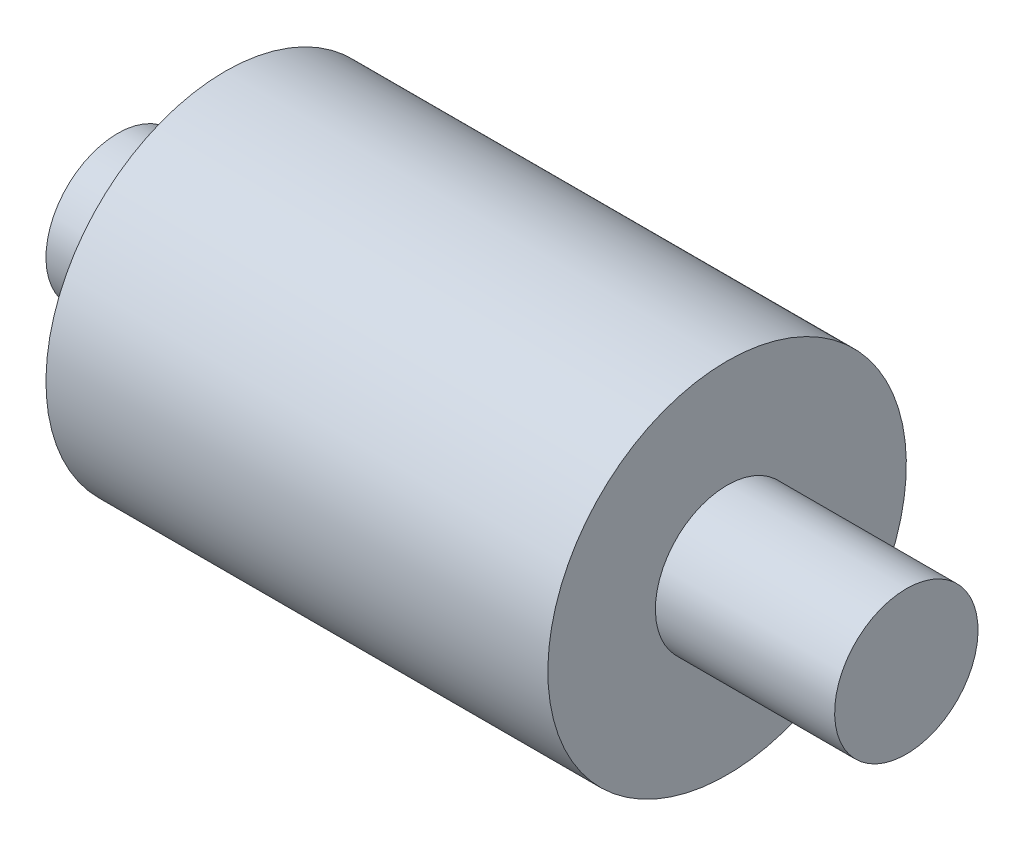
ISO-10303-21;
HEADER;
FILE_DESCRIPTION(('STEP AP214'),'2;1');
FILE_NAME('part.step','',(''),(''),'','','');
FILE_SCHEMA(('AUTOMOTIVE_DESIGN { 1 0 10303 214 1 1 1 1 }'));
ENDSEC;
DATA;
#1=APPLICATION_CONTEXT('core data for automotive mechanical design processes');
#2=APPLICATION_PROTOCOL_DEFINITION('international standard','automotive_design',2000,#1);
#3=PRODUCT_CONTEXT('',#1,'mechanical');
#4=PRODUCT('Part','Part','',(#3));
#5=PRODUCT_RELATED_PRODUCT_CATEGORY('part','',(#4));
#6=PRODUCT_DEFINITION_FORMATION('','',#4);
#7=PRODUCT_DEFINITION_CONTEXT('part definition',#1,'design');
#8=PRODUCT_DEFINITION('design','',#6,#7);
#9=PRODUCT_DEFINITION_SHAPE('','',#8);
#10=(LENGTH_UNIT() NAMED_UNIT(*) SI_UNIT(.MILLI.,.METRE.));
#11=(NAMED_UNIT(*) PLANE_ANGLE_UNIT() SI_UNIT($,.RADIAN.));
#12=(NAMED_UNIT(*) SI_UNIT($,.STERADIAN.) SOLID_ANGLE_UNIT());
#13=UNCERTAINTY_MEASURE_WITH_UNIT(LENGTH_MEASURE(1.E-05),#10,'distance_accuracy_value','');
#14=(GEOMETRIC_REPRESENTATION_CONTEXT(3) GLOBAL_UNCERTAINTY_ASSIGNED_CONTEXT((#13)) GLOBAL_UNIT_ASSIGNED_CONTEXT((#10,
#11,#12)) REPRESENTATION_CONTEXT('',''));
#15=CARTESIAN_POINT('',(0.,0.,0.));
#16=DIRECTION('',(0.,0.,1.));
#17=DIRECTION('',(1.,0.,0.));
#18=AXIS2_PLACEMENT_3D('',#15,#16,#17);
#19=CARTESIAN_POINT('',(-38.291065143824,-2.,0.));
#20=DIRECTION('',(-1.,0.,0.));
#21=DIRECTION('',(0.,-1.,0.));
#22=AXIS2_PLACEMENT_3D('',#19,#20,#21);
#23=PLANE('',#22);
#24=CARTESIAN_POINT('',(-38.291065143824,-2.,0.));
#25=DIRECTION('',(1.,0.,0.));
#26=DIRECTION('',(0.,1.,0.));
#27=AXIS2_PLACEMENT_3D('',#24,#25,#26);
#28=CIRCLE('',#27,2.);
#29=CARTESIAN_POINT('',(-38.291065143824,0.,0.));
#30=VERTEX_POINT('',#29);
#31=EDGE_CURVE('E10',#30,#30,#28,.T.);
#32=ORIENTED_EDGE('',*,*,#31,.F.);
#33=EDGE_LOOP('',(#32));
#34=FACE_BOUND('',#33,.T.);
#35=ADVANCED_FACE('F30',(#34),#23,.T.);
#36=CARTESIAN_POINT('',(-16.291065143824,-2.,0.));
#37=DIRECTION('',(1.,0.,0.));
#38=DIRECTION('',(0.,1.,0.));
#39=AXIS2_PLACEMENT_3D('',#36,#37,#38);
#40=CYLINDRICAL_SURFACE('',#39,2.);
#41=ORIENTED_EDGE('',*,*,#31,.T.);
#42=EDGE_LOOP('',(#41));
#43=FACE_BOUND('',#42,.T.);
#44=CARTESIAN_POINT('',(-35.291065143824,-2.,0.));
#45=DIRECTION('',(1.,0.,0.));
#46=DIRECTION('',(0.,1.,0.));
#47=AXIS2_PLACEMENT_3D('',#44,#45,#46);
#48=CIRCLE('',#47,2.);
#49=CARTESIAN_POINT('',(-35.291065143824,0.,0.));
#50=VERTEX_POINT('',#49);
#51=EDGE_CURVE('E36',#50,#50,#48,.T.);
#52=ORIENTED_EDGE('',*,*,#51,.F.);
#53=EDGE_LOOP('',(#52));
#54=FACE_BOUND('',#53,.T.);
#55=ADVANCED_FACE('F72',(#43,#54),#40,.T.);
#56=CARTESIAN_POINT('',(-35.291065143824,0.,0.));
#57=DIRECTION('',(-1.,0.,0.));
#58=DIRECTION('',(0.,-1.,0.));
#59=AXIS2_PLACEMENT_3D('',#56,#57,#58);
#60=PLANE('',#59);
#61=ORIENTED_EDGE('',*,*,#51,.T.);
#62=EDGE_LOOP('',(#61));
#63=FACE_BOUND('',#62,.T.);
#64=CARTESIAN_POINT('',(-35.291065143824,-2.,0.));
#65=DIRECTION('',(1.,0.,0.));
#66=DIRECTION('',(0.,1.,0.));
#67=AXIS2_PLACEMENT_3D('',#64,#65,#66);
#68=CIRCLE('',#67,5.);
#69=CARTESIAN_POINT('',(-35.291065143824,3.,0.));
#70=VERTEX_POINT('',#69);
#71=EDGE_CURVE('E40',#70,#70,#68,.T.);
#72=ORIENTED_EDGE('',*,*,#71,.F.);
#73=EDGE_LOOP('',(#72));
#74=FACE_BOUND('',#73,.T.);
#75=ADVANCED_FACE('F77',(#63,#74),#60,.T.);
#76=CARTESIAN_POINT('',(-16.291065143824,-2.,0.));
#77=DIRECTION('',(1.,0.,0.));
#78=DIRECTION('',(0.,1.,0.));
#79=AXIS2_PLACEMENT_3D('',#76,#77,#78);
#80=CYLINDRICAL_SURFACE('',#79,5.);
#81=ORIENTED_EDGE('',*,*,#71,.T.);
#82=EDGE_LOOP('',(#81));
#83=FACE_BOUND('',#82,.T.);
#84=CARTESIAN_POINT('',(-21.291065143824,-2.,0.));
#85=DIRECTION('',(1.,0.,0.));
#86=DIRECTION('',(0.,1.,0.));
#87=AXIS2_PLACEMENT_3D('',#84,#85,#86);
#88=CIRCLE('',#87,5.);
#89=CARTESIAN_POINT('',(-21.291065143824,3.,0.));
#90=VERTEX_POINT('',#89);
#91=EDGE_CURVE('E44',#90,#90,#88,.T.);
#92=ORIENTED_EDGE('',*,*,#91,.F.);
#93=EDGE_LOOP('',(#92));
#94=FACE_BOUND('',#93,.T.);
#95=ADVANCED_FACE('F68',(#83,#94),#80,.T.);
#96=CARTESIAN_POINT('',(-21.291065143824,3.,0.));
#97=DIRECTION('',(1.,0.,0.));
#98=DIRECTION('',(0.,1.,0.));
#99=AXIS2_PLACEMENT_3D('',#96,#97,#98);
#100=PLANE('',#99);
#101=ORIENTED_EDGE('',*,*,#91,.T.);
#102=EDGE_LOOP('',(#101));
#103=FACE_BOUND('',#102,.T.);
#104=CARTESIAN_POINT('',(-21.291065143824,-2.,0.));
#105=DIRECTION('',(1.,0.,0.));
#106=DIRECTION('',(0.,1.,0.));
#107=AXIS2_PLACEMENT_3D('',#104,#105,#106);
#108=CIRCLE('',#107,2.);
#109=CARTESIAN_POINT('',(-21.291065143824,0.,0.));
#110=VERTEX_POINT('',#109);
#111=EDGE_CURVE('E49',#110,#110,#108,.T.);
#112=ORIENTED_EDGE('',*,*,#111,.F.);
#113=EDGE_LOOP('',(#112));
#114=FACE_BOUND('',#113,.T.);
#115=ADVANCED_FACE('F60',(#103,#114),#100,.T.);
#116=CARTESIAN_POINT('',(-16.291065143824,-2.,0.));
#117=DIRECTION('',(1.,0.,0.));
#118=DIRECTION('',(0.,1.,0.));
#119=AXIS2_PLACEMENT_3D('',#116,#117,#118);
#120=CYLINDRICAL_SURFACE('',#119,2.);
#121=ORIENTED_EDGE('',*,*,#111,.T.);
#122=EDGE_LOOP('',(#121));
#123=FACE_BOUND('',#122,.T.);
#124=CARTESIAN_POINT('',(-16.291065143824,-2.,0.));
#125=DIRECTION('',(1.,0.,0.));
#126=DIRECTION('',(0.,1.,0.));
#127=AXIS2_PLACEMENT_3D('',#124,#125,#126);
#128=CIRCLE('',#127,2.);
#129=CARTESIAN_POINT('',(-16.291065143824,0.,0.));
#130=VERTEX_POINT('',#129);
#131=EDGE_CURVE('E52',#130,#130,#128,.T.);
#132=ORIENTED_EDGE('',*,*,#131,.F.);
#133=EDGE_LOOP('',(#132));
#134=FACE_BOUND('',#133,.T.);
#135=ADVANCED_FACE('F58',(#123,#134),#120,.T.);
#136=CARTESIAN_POINT('',(-16.291065143824,0.,0.));
#137=DIRECTION('',(1.,0.,0.));
#138=DIRECTION('',(0.,1.,0.));
#139=AXIS2_PLACEMENT_3D('',#136,#137,#138);
#140=PLANE('',#139);
#141=ORIENTED_EDGE('',*,*,#131,.T.);
#142=EDGE_LOOP('',(#141));
#143=FACE_BOUND('',#142,.T.);
#144=ADVANCED_FACE('F56',(#143),#140,.T.);
#145=CLOSED_SHELL('',(#35,#55,#75,#95,#115,#135,#144));
#146=MANIFOLD_SOLID_BREP('B2',#145);
#147=ADVANCED_BREP_SHAPE_REPRESENTATION('',(#18,#146),#14);
#148=SHAPE_DEFINITION_REPRESENTATION(#9,#147);
ENDSEC;
END-ISO-10303-21;
